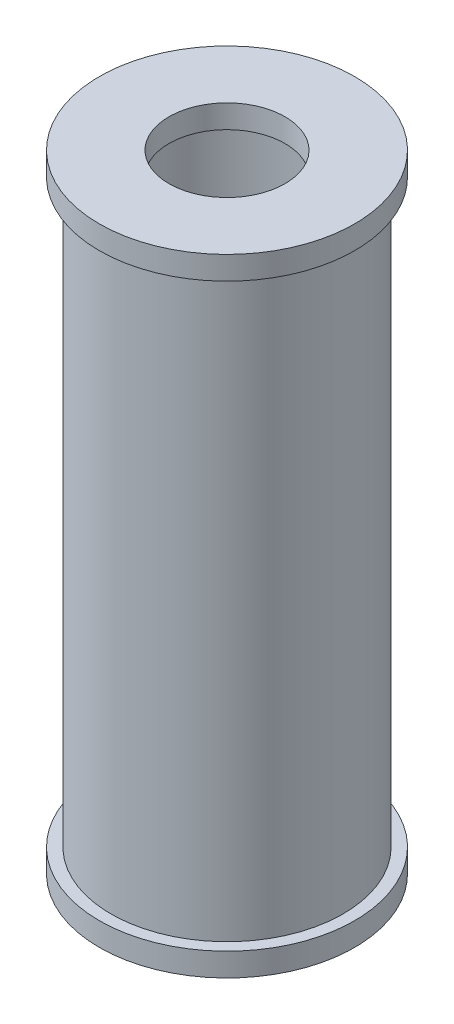
ISO-10303-21;
HEADER;
FILE_DESCRIPTION(('STEP AP214'),'2;1');
FILE_NAME('part.step','',(''),(''),'','','');
FILE_SCHEMA(('AUTOMOTIVE_DESIGN { 1 0 10303 214 1 1 1 1 }'));
ENDSEC;
DATA;
#1=APPLICATION_CONTEXT('core data for automotive mechanical design processes');
#2=APPLICATION_PROTOCOL_DEFINITION('international standard','automotive_design',2000,#1);
#3=PRODUCT_CONTEXT('',#1,'mechanical');
#4=PRODUCT('Part','Part','',(#3));
#5=PRODUCT_RELATED_PRODUCT_CATEGORY('part','',(#4));
#6=PRODUCT_DEFINITION_FORMATION('','',#4);
#7=PRODUCT_DEFINITION_CONTEXT('part definition',#1,'design');
#8=PRODUCT_DEFINITION('design','',#6,#7);
#9=PRODUCT_DEFINITION_SHAPE('','',#8);
#10=(LENGTH_UNIT() NAMED_UNIT(*) SI_UNIT(.MILLI.,.METRE.));
#11=(NAMED_UNIT(*) PLANE_ANGLE_UNIT() SI_UNIT($,.RADIAN.));
#12=(NAMED_UNIT(*) SI_UNIT($,.STERADIAN.) SOLID_ANGLE_UNIT());
#13=UNCERTAINTY_MEASURE_WITH_UNIT(LENGTH_MEASURE(1.E-05),#10,'distance_accuracy_value','');
#14=(GEOMETRIC_REPRESENTATION_CONTEXT(3) GLOBAL_UNCERTAINTY_ASSIGNED_CONTEXT((#13)) GLOBAL_UNIT_ASSIGNED_CONTEXT((#10,
#11,#12)) REPRESENTATION_CONTEXT('',''));
#15=CARTESIAN_POINT('',(0.,0.,0.));
#16=DIRECTION('',(0.,0.,1.));
#17=DIRECTION('',(1.,0.,0.));
#18=AXIS2_PLACEMENT_3D('',#15,#16,#17);
#19=CARTESIAN_POINT('',(0.,100.,0.));
#20=DIRECTION('',(0.,1.,0.));
#21=DIRECTION('',(0.,0.,1.));
#22=AXIS2_PLACEMENT_3D('',#19,#20,#21);
#23=PLANE('',#22);
#24=CARTESIAN_POINT('',(0.,100.,0.));
#25=DIRECTION('',(0.,1.,0.));
#26=DIRECTION('',(0.,0.,1.));
#27=AXIS2_PLACEMENT_3D('',#24,#25,#26);
#28=CIRCLE('',#27,10.);
#29=CARTESIAN_POINT('',(0.,100.,10.));
#30=VERTEX_POINT('',#29);
#31=EDGE_CURVE('E67',#30,#30,#28,.T.);
#32=ORIENTED_EDGE('',*,*,#31,.T.);
#33=EDGE_LOOP('',(#32));
#34=FACE_BOUND('',#33,.T.);
#35=CARTESIAN_POINT('',(0.,100.,0.));
#36=DIRECTION('',(0.,-1.,0.));
#37=DIRECTION('',(0.,0.,-1.));
#38=AXIS2_PLACEMENT_3D('',#35,#36,#37);
#39=CIRCLE('',#38,18.);
#40=CARTESIAN_POINT('',(0.,100.,-18.));
#41=VERTEX_POINT('',#40);
#42=EDGE_CURVE('E10',#41,#41,#39,.T.);
#43=ORIENTED_EDGE('',*,*,#42,.T.);
#44=EDGE_LOOP('',(#43));
#45=FACE_BOUND('',#44,.T.);
#46=ADVANCED_FACE('F37',(#34,#45),#23,.F.);
#47=CARTESIAN_POINT('',(0.,0.,0.));
#48=DIRECTION('',(0.,-1.,0.));
#49=DIRECTION('',(0.,0.,-1.));
#50=AXIS2_PLACEMENT_3D('',#47,#48,#49);
#51=CYLINDRICAL_SURFACE('',#50,18.);
#52=CARTESIAN_POINT('',(0.,0.,0.));
#53=DIRECTION('',(0.,-1.,0.));
#54=DIRECTION('',(0.,0.,-1.));
#55=AXIS2_PLACEMENT_3D('',#52,#53,#54);
#56=CIRCLE('',#55,18.);
#57=CARTESIAN_POINT('',(0.,0.,-18.));
#58=VERTEX_POINT('',#57);
#59=EDGE_CURVE('E55',#58,#58,#56,.T.);
#60=ORIENTED_EDGE('',*,*,#59,.T.);
#61=EDGE_LOOP('',(#60));
#62=FACE_BOUND('',#61,.T.);
#63=ORIENTED_EDGE('',*,*,#42,.F.);
#64=EDGE_LOOP('',(#63));
#65=FACE_BOUND('',#64,.T.);
#66=ADVANCED_FACE('F39',(#62,#65),#51,.F.);
#67=CARTESIAN_POINT('',(0.,0.,0.));
#68=DIRECTION('',(0.,-1.,0.));
#69=DIRECTION('',(0.,0.,-1.));
#70=AXIS2_PLACEMENT_3D('',#67,#68,#69);
#71=PLANE('',#70);
#72=ORIENTED_EDGE('',*,*,#59,.F.);
#73=EDGE_LOOP('',(#72));
#74=FACE_BOUND('',#73,.T.);
#75=ADVANCED_FACE('F81',(#74),#71,.F.);
#76=CARTESIAN_POINT('',(0.,100.,0.));
#77=DIRECTION('',(0.,1.,0.));
#78=DIRECTION('',(0.,0.,1.));
#79=AXIS2_PLACEMENT_3D('',#76,#77,#78);
#80=CYLINDRICAL_SURFACE('',#79,10.);
#81=ORIENTED_EDGE('',*,*,#31,.F.);
#82=EDGE_LOOP('',(#81));
#83=FACE_BOUND('',#82,.T.);
#84=CARTESIAN_POINT('',(0.,104.,0.));
#85=DIRECTION('',(0.,1.,0.));
#86=DIRECTION('',(0.,0.,1.));
#87=AXIS2_PLACEMENT_3D('',#84,#85,#86);
#88=CIRCLE('',#87,10.);
#89=CARTESIAN_POINT('',(0.,104.,10.));
#90=VERTEX_POINT('',#89);
#91=EDGE_CURVE('E70',#90,#90,#88,.T.);
#92=ORIENTED_EDGE('',*,*,#91,.T.);
#93=EDGE_LOOP('',(#92));
#94=FACE_BOUND('',#93,.T.);
#95=ADVANCED_FACE('F77',(#83,#94),#80,.F.);
#96=CARTESIAN_POINT('',(0.,0.,0.));
#97=DIRECTION('',(0.,-1.,0.));
#98=DIRECTION('',(0.,0.,-1.));
#99=AXIS2_PLACEMENT_3D('',#96,#97,#98);
#100=CYLINDRICAL_SURFACE('',#99,20.);
#101=CARTESIAN_POINT('',(0.,100.,0.));
#102=DIRECTION('',(0.,-1.,0.));
#103=DIRECTION('',(0.,0.,-1.));
#104=AXIS2_PLACEMENT_3D('',#101,#102,#103);
#105=CIRCLE('',#104,20.);
#106=CARTESIAN_POINT('',(0.,100.,-20.));
#107=VERTEX_POINT('',#106);
#108=EDGE_CURVE('E48',#107,#107,#105,.T.);
#109=ORIENTED_EDGE('',*,*,#108,.T.);
#110=EDGE_LOOP('',(#109));
#111=FACE_BOUND('',#110,.T.);
#112=CARTESIAN_POINT('',(0.,0.,0.));
#113=DIRECTION('',(0.,-1.,0.));
#114=DIRECTION('',(0.,0.,-1.));
#115=AXIS2_PLACEMENT_3D('',#112,#113,#114);
#116=CIRCLE('',#115,20.);
#117=CARTESIAN_POINT('',(0.,0.,-20.));
#118=VERTEX_POINT('',#117);
#119=EDGE_CURVE('E44',#118,#118,#116,.T.);
#120=ORIENTED_EDGE('',*,*,#119,.F.);
#121=EDGE_LOOP('',(#120));
#122=FACE_BOUND('',#121,.T.);
#123=ADVANCED_FACE('F80',(#111,#122),#100,.T.);
#124=ORIENTED_EDGE('',*,*,#108,.F.);
#125=EDGE_LOOP('',(#124));
#126=FACE_BOUND('',#125,.T.);
#127=CARTESIAN_POINT('',(0.,100.,0.));
#128=DIRECTION('',(0.,1.,0.));
#129=DIRECTION('',(0.,0.,1.));
#130=AXIS2_PLACEMENT_3D('',#127,#128,#129);
#131=CIRCLE('',#130,22.);
#132=CARTESIAN_POINT('',(0.,100.,22.));
#133=VERTEX_POINT('',#132);
#134=EDGE_CURVE('E58',#133,#133,#131,.T.);
#135=ORIENTED_EDGE('',*,*,#134,.F.);
#136=EDGE_LOOP('',(#135));
#137=FACE_BOUND('',#136,.T.);
#138=ADVANCED_FACE('F89',(#126,#137),#23,.F.);
#139=CARTESIAN_POINT('',(0.,104.,0.));
#140=DIRECTION('',(0.,1.,0.));
#141=DIRECTION('',(0.,0.,1.));
#142=AXIS2_PLACEMENT_3D('',#139,#140,#141);
#143=PLANE('',#142);
#144=ORIENTED_EDGE('',*,*,#91,.F.);
#145=EDGE_LOOP('',(#144));
#146=FACE_BOUND('',#145,.T.);
#147=CARTESIAN_POINT('',(0.,104.,0.));
#148=DIRECTION('',(0.,1.,0.));
#149=DIRECTION('',(0.,0.,1.));
#150=AXIS2_PLACEMENT_3D('',#147,#148,#149);
#151=CIRCLE('',#150,22.);
#152=CARTESIAN_POINT('',(0.,104.,22.));
#153=VERTEX_POINT('',#152);
#154=EDGE_CURVE('E53',#153,#153,#151,.T.);
#155=ORIENTED_EDGE('',*,*,#154,.T.);
#156=EDGE_LOOP('',(#155));
#157=FACE_BOUND('',#156,.T.);
#158=ADVANCED_FACE('F85',(#146,#157),#143,.T.);
#159=CARTESIAN_POINT('',(0.,104.,0.));
#160=DIRECTION('',(0.,-1.,0.));
#161=DIRECTION('',(0.,0.,-1.));
#162=AXIS2_PLACEMENT_3D('',#159,#160,#161);
#163=CYLINDRICAL_SURFACE('',#162,22.);
#164=ORIENTED_EDGE('',*,*,#154,.F.);
#165=EDGE_LOOP('',(#164));
#166=FACE_BOUND('',#165,.T.);
#167=ORIENTED_EDGE('',*,*,#134,.T.);
#168=EDGE_LOOP('',(#167));
#169=FACE_BOUND('',#168,.T.);
#170=ADVANCED_FACE('F88',(#166,#169),#163,.T.);
#171=CARTESIAN_POINT('',(0.,-4.,0.));
#172=DIRECTION('',(0.,1.,0.));
#173=DIRECTION('',(0.,0.,1.));
#174=AXIS2_PLACEMENT_3D('',#171,#172,#173);
#175=CYLINDRICAL_SURFACE('',#174,22.);
#176=CARTESIAN_POINT('',(0.,-4.,0.));
#177=DIRECTION('',(0.,-1.,0.));
#178=DIRECTION('',(0.,0.,-1.));
#179=AXIS2_PLACEMENT_3D('',#176,#177,#178);
#180=CIRCLE('',#179,22.);
#181=CARTESIAN_POINT('',(0.,-4.,-22.));
#182=VERTEX_POINT('',#181);
#183=EDGE_CURVE('E59',#182,#182,#180,.T.);
#184=ORIENTED_EDGE('',*,*,#183,.F.);
#185=EDGE_LOOP('',(#184));
#186=FACE_BOUND('',#185,.T.);
#187=CARTESIAN_POINT('',(0.,0.,0.));
#188=DIRECTION('',(0.,-1.,0.));
#189=DIRECTION('',(0.,0.,-1.));
#190=AXIS2_PLACEMENT_3D('',#187,#188,#189);
#191=CIRCLE('',#190,22.);
#192=CARTESIAN_POINT('',(0.,0.,-22.));
#193=VERTEX_POINT('',#192);
#194=EDGE_CURVE('E64',#193,#193,#191,.T.);
#195=ORIENTED_EDGE('',*,*,#194,.T.);
#196=EDGE_LOOP('',(#195));
#197=FACE_BOUND('',#196,.T.);
#198=ADVANCED_FACE('F95',(#186,#197),#175,.T.);
#199=CARTESIAN_POINT('',(0.,-4.,0.));
#200=DIRECTION('',(0.,-1.,0.));
#201=DIRECTION('',(0.,0.,-1.));
#202=AXIS2_PLACEMENT_3D('',#199,#200,#201);
#203=PLANE('',#202);
#204=ORIENTED_EDGE('',*,*,#183,.T.);
#205=EDGE_LOOP('',(#204));
#206=FACE_BOUND('',#205,.T.);
#207=ADVANCED_FACE('F125',(#206),#203,.T.);
#208=ORIENTED_EDGE('',*,*,#119,.T.);
#209=EDGE_LOOP('',(#208));
#210=FACE_BOUND('',#209,.T.);
#211=ORIENTED_EDGE('',*,*,#194,.F.);
#212=EDGE_LOOP('',(#211));
#213=FACE_BOUND('',#212,.T.);
#214=ADVANCED_FACE('F117',(#210,#213),#71,.F.);
#215=CLOSED_SHELL('',(#46,#66,#75,#95,#123,#138,#158,#170,#198,#207,#214));
#216=MANIFOLD_SOLID_BREP('B2',#215);
#217=ADVANCED_BREP_SHAPE_REPRESENTATION('',(#18,#216),#14);
#218=SHAPE_DEFINITION_REPRESENTATION(#9,#217);
ENDSEC;
END-ISO-10303-21;
